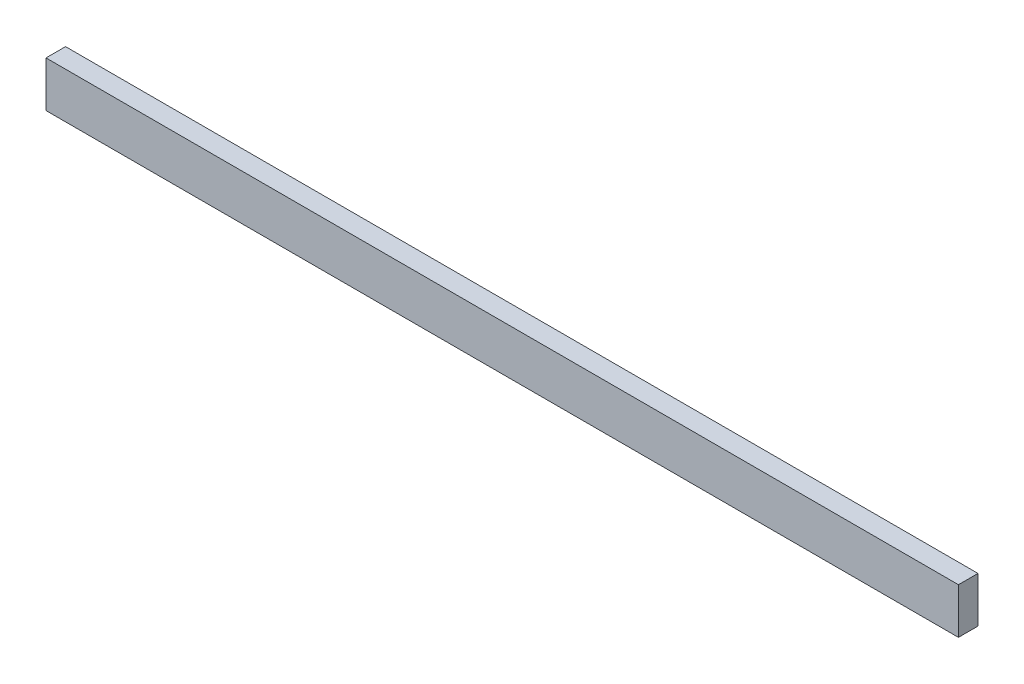
ISO-10303-21;
HEADER;
FILE_DESCRIPTION(('STEP AP214'),'2;1');
FILE_NAME('part.step','',(''),(''),'','','');
FILE_SCHEMA(('AUTOMOTIVE_DESIGN { 1 0 10303 214 1 1 1 1 }'));
ENDSEC;
DATA;
#1=APPLICATION_CONTEXT('core data for automotive mechanical design processes');
#2=APPLICATION_PROTOCOL_DEFINITION('international standard','automotive_design',2000,#1);
#3=PRODUCT_CONTEXT('',#1,'mechanical');
#4=PRODUCT('Part','Part','',(#3));
#5=PRODUCT_RELATED_PRODUCT_CATEGORY('part','',(#4));
#6=PRODUCT_DEFINITION_FORMATION('','',#4);
#7=PRODUCT_DEFINITION_CONTEXT('part definition',#1,'design');
#8=PRODUCT_DEFINITION('design','',#6,#7);
#9=PRODUCT_DEFINITION_SHAPE('','',#8);
#10=(LENGTH_UNIT() NAMED_UNIT(*) SI_UNIT(.MILLI.,.METRE.));
#11=(NAMED_UNIT(*) PLANE_ANGLE_UNIT() SI_UNIT($,.RADIAN.));
#12=(NAMED_UNIT(*) SI_UNIT($,.STERADIAN.) SOLID_ANGLE_UNIT());
#13=UNCERTAINTY_MEASURE_WITH_UNIT(LENGTH_MEASURE(1.E-05),#10,'distance_accuracy_value','');
#14=(GEOMETRIC_REPRESENTATION_CONTEXT(3) GLOBAL_UNCERTAINTY_ASSIGNED_CONTEXT((#13)) GLOBAL_UNIT_ASSIGNED_CONTEXT((#10,
#11,#12)) REPRESENTATION_CONTEXT('',''));
#15=CARTESIAN_POINT('',(0.,0.,0.));
#16=DIRECTION('',(0.,0.,1.));
#17=DIRECTION('',(1.,0.,0.));
#18=AXIS2_PLACEMENT_3D('',#15,#16,#17);
#19=CARTESIAN_POINT('',(1778.,0.,0.));
#20=DIRECTION('',(0.,0.,-1.));
#21=DIRECTION('',(-1.,0.,0.));
#22=AXIS2_PLACEMENT_3D('',#19,#20,#21);
#23=PLANE('',#22);
#24=DIRECTION('',(0.,-1.,0.));
#25=VECTOR('',#24,1.);
#26=CARTESIAN_POINT('',(0.,0.,0.));
#27=LINE('',#26,#25);
#28=CARTESIAN_POINT('',(0.,88.9,0.));
#29=VERTEX_POINT('',#28);
#30=CARTESIAN_POINT('',(0.,0.,0.));
#31=VERTEX_POINT('',#30);
#32=EDGE_CURVE('E97',#29,#31,#27,.T.);
#33=ORIENTED_EDGE('',*,*,#32,.T.);
#34=DIRECTION('',(-1.,0.,0.));
#35=VECTOR('',#34,1.);
#36=CARTESIAN_POINT('',(1778.,0.,0.));
#37=LINE('',#36,#35);
#38=CARTESIAN_POINT('',(1778.,0.,0.));
#39=VERTEX_POINT('',#38);
#40=EDGE_CURVE('E11',#39,#31,#37,.T.);
#41=ORIENTED_EDGE('',*,*,#40,.F.);
#42=DIRECTION('',(0.,-1.,0.));
#43=VECTOR('',#42,1.);
#44=CARTESIAN_POINT('',(1778.,0.,0.));
#45=LINE('',#44,#43);
#46=CARTESIAN_POINT('',(1778.,88.9,0.));
#47=VERTEX_POINT('',#46);
#48=EDGE_CURVE('E85',#47,#39,#45,.T.);
#49=ORIENTED_EDGE('',*,*,#48,.F.);
#50=DIRECTION('',(-1.,0.,0.));
#51=VECTOR('',#50,1.);
#52=CARTESIAN_POINT('',(1778.,88.9,0.));
#53=LINE('',#52,#51);
#54=EDGE_CURVE('E93',#47,#29,#53,.T.);
#55=ORIENTED_EDGE('',*,*,#54,.T.);
#56=EDGE_LOOP('',(#33,#41,#49,#55));
#57=FACE_BOUND('',#56,.T.);
#58=ADVANCED_FACE('F34',(#57),#23,.F.);
#59=CARTESIAN_POINT('',(1778.,0.,0.));
#60=DIRECTION('',(0.,1.,0.));
#61=DIRECTION('',(0.,0.,1.));
#62=AXIS2_PLACEMENT_3D('',#59,#60,#61);
#63=PLANE('',#62);
#64=DIRECTION('',(0.,0.,-1.));
#65=VECTOR('',#64,1.);
#66=CARTESIAN_POINT('',(0.,0.,0.));
#67=LINE('',#66,#65);
#68=CARTESIAN_POINT('',(0.,0.,-38.1));
#69=VERTEX_POINT('',#68);
#70=EDGE_CURVE('E89',#31,#69,#67,.T.);
#71=ORIENTED_EDGE('',*,*,#70,.T.);
#72=DIRECTION('',(-1.,0.,0.));
#73=VECTOR('',#72,1.);
#74=CARTESIAN_POINT('',(1778.,0.,-38.1));
#75=LINE('',#74,#73);
#76=CARTESIAN_POINT('',(1778.,0.,-38.1));
#77=VERTEX_POINT('',#76);
#78=EDGE_CURVE('E42',#77,#69,#75,.T.);
#79=ORIENTED_EDGE('',*,*,#78,.F.);
#80=DIRECTION('',(0.,0.,-1.));
#81=VECTOR('',#80,1.);
#82=CARTESIAN_POINT('',(1778.,0.,0.));
#83=LINE('',#82,#81);
#84=EDGE_CURVE('E80',#39,#77,#83,.T.);
#85=ORIENTED_EDGE('',*,*,#84,.F.);
#86=ORIENTED_EDGE('',*,*,#40,.T.);
#87=EDGE_LOOP('',(#71,#79,#85,#86));
#88=FACE_BOUND('',#87,.T.);
#89=ADVANCED_FACE('F88',(#88),#63,.F.);
#90=CARTESIAN_POINT('',(1778.,0.,-38.1));
#91=DIRECTION('',(0.,0.,1.));
#92=DIRECTION('',(1.,0.,0.));
#93=AXIS2_PLACEMENT_3D('',#90,#91,#92);
#94=PLANE('',#93);
#95=DIRECTION('',(0.,1.,0.));
#96=VECTOR('',#95,1.);
#97=CARTESIAN_POINT('',(0.,0.,-38.1));
#98=LINE('',#97,#96);
#99=CARTESIAN_POINT('',(0.,88.9,-38.1));
#100=VERTEX_POINT('',#99);
#101=EDGE_CURVE('E67',#69,#100,#98,.T.);
#102=ORIENTED_EDGE('',*,*,#101,.T.);
#103=DIRECTION('',(-1.,0.,0.));
#104=VECTOR('',#103,1.);
#105=CARTESIAN_POINT('',(1778.,88.9,-38.1));
#106=LINE('',#105,#104);
#107=CARTESIAN_POINT('',(1778.,88.9,-38.1));
#108=VERTEX_POINT('',#107);
#109=EDGE_CURVE('E90',#108,#100,#106,.T.);
#110=ORIENTED_EDGE('',*,*,#109,.F.);
#111=DIRECTION('',(0.,1.,0.));
#112=VECTOR('',#111,1.);
#113=CARTESIAN_POINT('',(1778.,0.,-38.1));
#114=LINE('',#113,#112);
#115=EDGE_CURVE('E83',#77,#108,#114,.T.);
#116=ORIENTED_EDGE('',*,*,#115,.F.);
#117=ORIENTED_EDGE('',*,*,#78,.T.);
#118=EDGE_LOOP('',(#102,#110,#116,#117));
#119=FACE_BOUND('',#118,.T.);
#120=ADVANCED_FACE('F91',(#119),#94,.F.);
#121=CARTESIAN_POINT('',(1778.,88.9,0.));
#122=DIRECTION('',(0.,-1.,0.));
#123=DIRECTION('',(0.,0.,-1.));
#124=AXIS2_PLACEMENT_3D('',#121,#122,#123);
#125=PLANE('',#124);
#126=DIRECTION('',(0.,0.,1.));
#127=VECTOR('',#126,1.);
#128=CARTESIAN_POINT('',(0.,88.9,0.));
#129=LINE('',#128,#127);
#130=EDGE_CURVE('E73',#100,#29,#129,.T.);
#131=ORIENTED_EDGE('',*,*,#130,.T.);
#132=ORIENTED_EDGE('',*,*,#54,.F.);
#133=DIRECTION('',(0.,0.,1.));
#134=VECTOR('',#133,1.);
#135=CARTESIAN_POINT('',(1778.,88.9,0.));
#136=LINE('',#135,#134);
#137=EDGE_CURVE('E50',#108,#47,#136,.T.);
#138=ORIENTED_EDGE('',*,*,#137,.F.);
#139=ORIENTED_EDGE('',*,*,#109,.T.);
#140=EDGE_LOOP('',(#131,#132,#138,#139));
#141=FACE_BOUND('',#140,.T.);
#142=ADVANCED_FACE('F104',(#141),#125,.F.);
#143=CARTESIAN_POINT('',(1778.,0.,0.));
#144=DIRECTION('',(-1.,0.,0.));
#145=DIRECTION('',(0.,0.,1.));
#146=AXIS2_PLACEMENT_3D('',#143,#144,#145);
#147=PLANE('',#146);
#148=ORIENTED_EDGE('',*,*,#48,.T.);
#149=ORIENTED_EDGE('',*,*,#84,.T.);
#150=ORIENTED_EDGE('',*,*,#115,.T.);
#151=ORIENTED_EDGE('',*,*,#137,.T.);
#152=EDGE_LOOP('',(#148,#149,#150,#151));
#153=FACE_BOUND('',#152,.T.);
#154=ADVANCED_FACE('F81',(#153),#147,.F.);
#155=CARTESIAN_POINT('',(0.,0.,0.));
#156=DIRECTION('',(-1.,0.,0.));
#157=DIRECTION('',(0.,0.,1.));
#158=AXIS2_PLACEMENT_3D('',#155,#156,#157);
#159=PLANE('',#158);
#160=ORIENTED_EDGE('',*,*,#32,.F.);
#161=ORIENTED_EDGE('',*,*,#130,.F.);
#162=ORIENTED_EDGE('',*,*,#101,.F.);
#163=ORIENTED_EDGE('',*,*,#70,.F.);
#164=EDGE_LOOP('',(#160,#161,#162,#163));
#165=FACE_BOUND('',#164,.T.);
#166=ADVANCED_FACE('F107',(#165),#159,.T.);
#167=CLOSED_SHELL('',(#58,#89,#120,#142,#154,#166));
#168=MANIFOLD_SOLID_BREP('B2',#167);
#169=ADVANCED_BREP_SHAPE_REPRESENTATION('',(#18,#168),#14);
#170=SHAPE_DEFINITION_REPRESENTATION(#9,#169);
ENDSEC;
END-ISO-10303-21;
